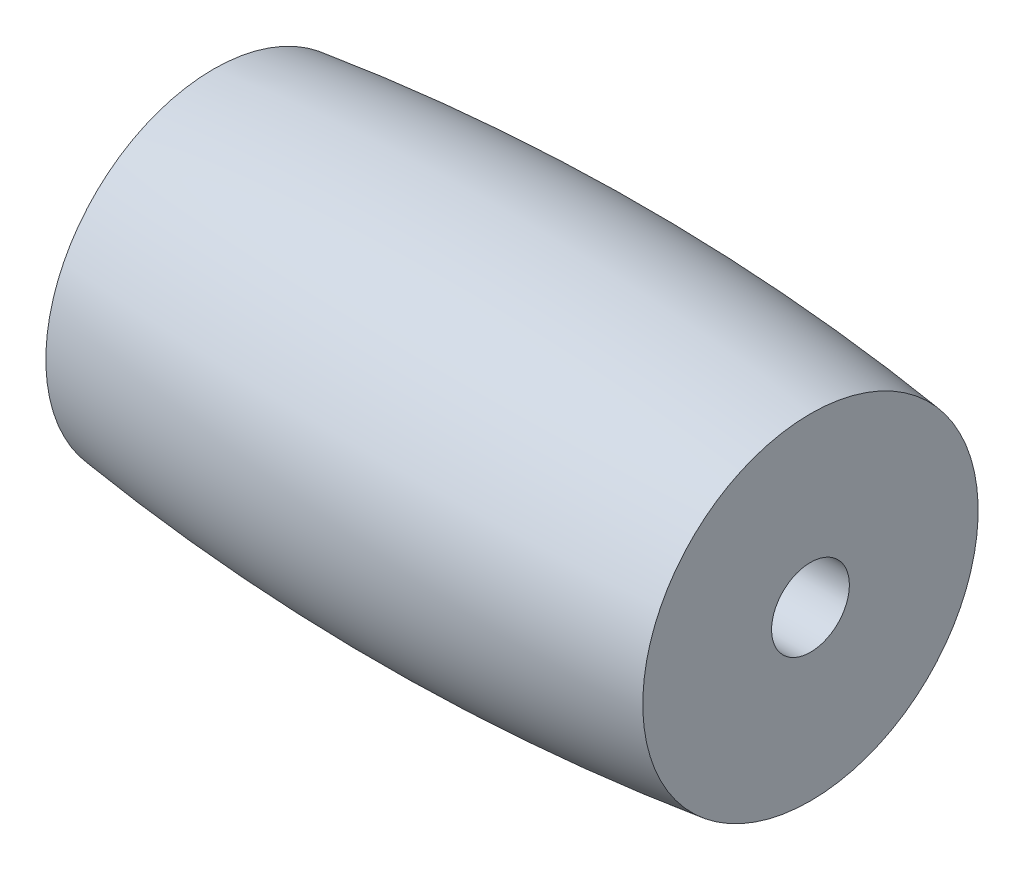
ISO-10303-21;
HEADER;
FILE_DESCRIPTION(('STEP AP214'),'2;1');
FILE_NAME('part.step','',(''),(''),'','','');
FILE_SCHEMA(('AUTOMOTIVE_DESIGN { 1 0 10303 214 1 1 1 1 }'));
ENDSEC;
DATA;
#1=APPLICATION_CONTEXT('core data for automotive mechanical design processes');
#2=APPLICATION_PROTOCOL_DEFINITION('international standard','automotive_design',2000,#1);
#3=PRODUCT_CONTEXT('',#1,'mechanical');
#4=PRODUCT('Part','Part','',(#3));
#5=PRODUCT_RELATED_PRODUCT_CATEGORY('part','',(#4));
#6=PRODUCT_DEFINITION_FORMATION('','',#4);
#7=PRODUCT_DEFINITION_CONTEXT('part definition',#1,'design');
#8=PRODUCT_DEFINITION('design','',#6,#7);
#9=PRODUCT_DEFINITION_SHAPE('','',#8);
#10=(LENGTH_UNIT() NAMED_UNIT(*) SI_UNIT(.MILLI.,.METRE.));
#11=(NAMED_UNIT(*) PLANE_ANGLE_UNIT() SI_UNIT($,.RADIAN.));
#12=(NAMED_UNIT(*) SI_UNIT($,.STERADIAN.) SOLID_ANGLE_UNIT());
#13=UNCERTAINTY_MEASURE_WITH_UNIT(LENGTH_MEASURE(1.E-05),#10,'distance_accuracy_value','');
#14=(GEOMETRIC_REPRESENTATION_CONTEXT(3) GLOBAL_UNCERTAINTY_ASSIGNED_CONTEXT((#13)) GLOBAL_UNIT_ASSIGNED_CONTEXT((#10,
#11,#12)) REPRESENTATION_CONTEXT('',''));
#15=CARTESIAN_POINT('',(0.,0.,0.));
#16=DIRECTION('',(0.,0.,1.));
#17=DIRECTION('',(1.,0.,0.));
#18=AXIS2_PLACEMENT_3D('',#15,#16,#17);
#19=CARTESIAN_POINT('',(0.,0.,0.));
#20=DIRECTION('',(1.,0.,0.));
#21=DIRECTION('',(0.,1.,0.));
#22=AXIS2_PLACEMENT_3D('',#19,#20,#21);
#23=CYLINDRICAL_SURFACE('',#22,0.736599999999999);
#24=CARTESIAN_POINT('',(5.6515,0.,0.));
#25=DIRECTION('',(1.,0.,0.));
#26=DIRECTION('',(0.,1.,0.));
#27=AXIS2_PLACEMENT_3D('',#24,#25,#26);
#28=CIRCLE('',#27,0.736599999999999);
#29=CARTESIAN_POINT('',(5.6515,0.736599999999999,0.));
#30=VERTEX_POINT('',#29);
#31=EDGE_CURVE('E57',#30,#30,#28,.T.);
#32=ORIENTED_EDGE('',*,*,#31,.T.);
#33=EDGE_LOOP('',(#32));
#34=FACE_BOUND('',#33,.T.);
#35=CARTESIAN_POINT('',(-5.6515,0.,0.));
#36=DIRECTION('',(1.,0.,0.));
#37=DIRECTION('',(0.,1.,0.));
#38=AXIS2_PLACEMENT_3D('',#35,#36,#37);
#39=CIRCLE('',#38,0.7366);
#40=CARTESIAN_POINT('',(-5.6515,0.736599999999999,0.));
#41=VERTEX_POINT('',#40);
#42=EDGE_CURVE('E10',#41,#41,#39,.T.);
#43=ORIENTED_EDGE('',*,*,#42,.F.);
#44=EDGE_LOOP('',(#43));
#45=FACE_BOUND('',#44,.T.);
#46=ADVANCED_FACE('F41',(#34,#45),#23,.F.);
#47=CARTESIAN_POINT('',(-5.6515,0.736599999999999,0.));
#48=DIRECTION('',(-1.,0.,0.));
#49=DIRECTION('',(0.,-1.,0.));
#50=AXIS2_PLACEMENT_3D('',#47,#48,#49);
#51=PLANE('',#50);
#52=ORIENTED_EDGE('',*,*,#42,.T.);
#53=EDGE_LOOP('',(#52));
#54=FACE_BOUND('',#53,.T.);
#55=CARTESIAN_POINT('',(-5.6515,0.,0.));
#56=DIRECTION('',(1.,0.,0.));
#57=DIRECTION('',(0.,1.,0.));
#58=AXIS2_PLACEMENT_3D('',#55,#56,#57);
#59=CIRCLE('',#58,3.17500000000001);
#60=CARTESIAN_POINT('',(-5.6515,3.175,0.));
#61=VERTEX_POINT('',#60);
#62=EDGE_CURVE('E48',#61,#61,#59,.T.);
#63=ORIENTED_EDGE('',*,*,#62,.F.);
#64=EDGE_LOOP('',(#63));
#65=FACE_BOUND('',#64,.T.);
#66=ADVANCED_FACE('F74',(#54,#65),#51,.T.);
#67=CARTESIAN_POINT('',(0.,0.,0.));
#68=DIRECTION('',(1.,0.,0.));
#69=DIRECTION('',(0.,1.,0.));
#70=AXIS2_PLACEMENT_3D('',#67,#68,#69);
#71=DEGENERATE_TOROIDAL_SURFACE('',#70,41.5564410714284,45.0870410714284,.F.);
#72=ORIENTED_EDGE('',*,*,#62,.T.);
#73=EDGE_LOOP('',(#72));
#74=FACE_BOUND('',#73,.T.);
#75=CARTESIAN_POINT('',(5.6515,0.,0.));
#76=DIRECTION('',(1.,0.,0.));
#77=DIRECTION('',(0.,1.,0.));
#78=AXIS2_PLACEMENT_3D('',#75,#76,#77);
#79=CIRCLE('',#78,3.175);
#80=CARTESIAN_POINT('',(5.6515,3.175,0.));
#81=VERTEX_POINT('',#80);
#82=EDGE_CURVE('E53',#81,#81,#79,.T.);
#83=ORIENTED_EDGE('',*,*,#82,.F.);
#84=EDGE_LOOP('',(#83));
#85=FACE_BOUND('',#84,.T.);
#86=ADVANCED_FACE('F67',(#74,#85),#71,.F.);
#87=CARTESIAN_POINT('',(5.6515,0.736599999999999,0.));
#88=DIRECTION('',(1.,0.,0.));
#89=DIRECTION('',(0.,1.,0.));
#90=AXIS2_PLACEMENT_3D('',#87,#88,#89);
#91=PLANE('',#90);
#92=ORIENTED_EDGE('',*,*,#82,.T.);
#93=EDGE_LOOP('',(#92));
#94=FACE_BOUND('',#93,.T.);
#95=ORIENTED_EDGE('',*,*,#31,.F.);
#96=EDGE_LOOP('',(#95));
#97=FACE_BOUND('',#96,.T.);
#98=ADVANCED_FACE('F65',(#94,#97),#91,.T.);
#99=CLOSED_SHELL('',(#46,#66,#86,#98));
#100=MANIFOLD_SOLID_BREP('B2',#99);
#101=ADVANCED_BREP_SHAPE_REPRESENTATION('',(#18,#100),#14);
#102=SHAPE_DEFINITION_REPRESENTATION(#9,#101);
ENDSEC;
END-ISO-10303-21;
